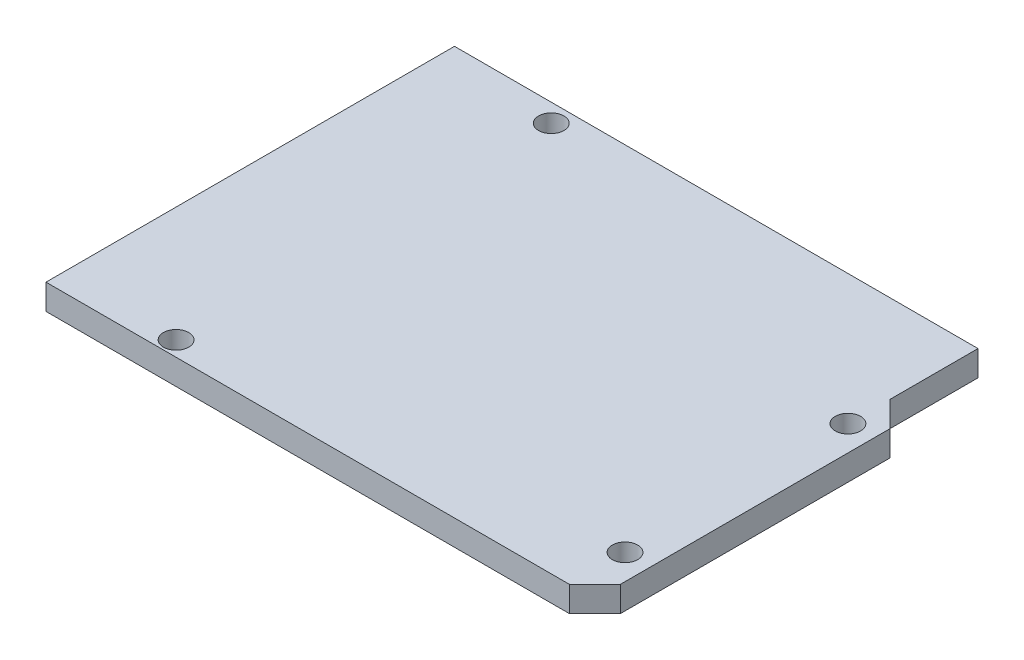
ISO-10303-21;
HEADER;
FILE_DESCRIPTION(('STEP AP214'),'2;1');
FILE_NAME('part.step','',(''),(''),'','','');
FILE_SCHEMA(('AUTOMOTIVE_DESIGN { 1 0 10303 214 1 1 1 1 }'));
ENDSEC;
DATA;
#1=APPLICATION_CONTEXT('core data for automotive mechanical design processes');
#2=APPLICATION_PROTOCOL_DEFINITION('international standard','automotive_design',2000,#1);
#3=PRODUCT_CONTEXT('',#1,'mechanical');
#4=PRODUCT('Part','Part','',(#3));
#5=PRODUCT_RELATED_PRODUCT_CATEGORY('part','',(#4));
#6=PRODUCT_DEFINITION_FORMATION('','',#4);
#7=PRODUCT_DEFINITION_CONTEXT('part definition',#1,'design');
#8=PRODUCT_DEFINITION('design','',#6,#7);
#9=PRODUCT_DEFINITION_SHAPE('','',#8);
#10=(LENGTH_UNIT() NAMED_UNIT(*) SI_UNIT(.MILLI.,.METRE.));
#11=(NAMED_UNIT(*) PLANE_ANGLE_UNIT() SI_UNIT($,.RADIAN.));
#12=(NAMED_UNIT(*) SI_UNIT($,.STERADIAN.) SOLID_ANGLE_UNIT());
#13=UNCERTAINTY_MEASURE_WITH_UNIT(LENGTH_MEASURE(1.E-05),#10,'distance_accuracy_value','');
#14=(GEOMETRIC_REPRESENTATION_CONTEXT(3) GLOBAL_UNCERTAINTY_ASSIGNED_CONTEXT((#13)) GLOBAL_UNIT_ASSIGNED_CONTEXT((#10,
#11,#12)) REPRESENTATION_CONTEXT('',''));
#15=CARTESIAN_POINT('',(0.,0.,0.));
#16=DIRECTION('',(0.,0.,1.));
#17=DIRECTION('',(1.,0.,0.));
#18=AXIS2_PLACEMENT_3D('',#15,#16,#17);
#19=CARTESIAN_POINT('',(0.,3.2,0.));
#20=DIRECTION('',(0.,1.,0.));
#21=DIRECTION('',(0.,0.,1.));
#22=AXIS2_PLACEMENT_3D('',#19,#20,#21);
#23=PLANE('',#22);
#24=CARTESIAN_POINT('',(66.,3.2,-7.));
#25=DIRECTION('',(0.,1.,0.));
#26=DIRECTION('',(0.,0.,1.));
#27=AXIS2_PLACEMENT_3D('',#24,#25,#26);
#28=CIRCLE('',#27,1.60000000000001);
#29=CARTESIAN_POINT('',(66.,3.2,-5.4));
#30=VERTEX_POINT('',#29);
#31=EDGE_CURVE('E178',#30,#30,#28,.T.);
#32=ORIENTED_EDGE('',*,*,#31,.F.);
#33=EDGE_LOOP('',(#32));
#34=FACE_BOUND('',#33,.T.);
#35=CARTESIAN_POINT('',(14.5,3.2,-1.9));
#36=DIRECTION('',(0.,1.,0.));
#37=DIRECTION('',(0.,0.,1.));
#38=AXIS2_PLACEMENT_3D('',#35,#36,#37);
#39=CIRCLE('',#38,1.6);
#40=CARTESIAN_POINT('',(14.5,3.2,-0.299999999999996));
#41=VERTEX_POINT('',#40);
#42=EDGE_CURVE('E136',#41,#41,#39,.T.);
#43=ORIENTED_EDGE('',*,*,#42,.F.);
#44=EDGE_LOOP('',(#43));
#45=FACE_BOUND('',#44,.T.);
#46=DIRECTION('',(0.,0.,1.));
#47=VECTOR('',#46,1.);
#48=CARTESIAN_POINT('',(0.,3.2,-51.5));
#49=LINE('',#48,#47);
#50=CARTESIAN_POINT('',(0.,3.2,-51.5));
#51=VERTEX_POINT('',#50);
#52=CARTESIAN_POINT('',(0.,3.2,0.));
#53=VERTEX_POINT('',#52);
#54=EDGE_CURVE('E145',#51,#53,#49,.T.);
#55=ORIENTED_EDGE('',*,*,#54,.T.);
#56=DIRECTION('',(1.,0.,0.));
#57=VECTOR('',#56,1.);
#58=CARTESIAN_POINT('',(0.,3.2,0.));
#59=LINE('',#58,#57);
#60=CARTESIAN_POINT('',(66.,3.2,0.));
#61=VERTEX_POINT('',#60);
#62=EDGE_CURVE('E98',#53,#61,#59,.T.);
#63=ORIENTED_EDGE('',*,*,#62,.T.);
#64=DIRECTION('',(0.707106781186546,0.,-0.707106781186549));
#65=VECTOR('',#64,1.);
#66=CARTESIAN_POINT('',(66.,3.2,0.));
#67=LINE('',#66,#65);
#68=CARTESIAN_POINT('',(69.2,3.2,-3.20000000000001));
#69=VERTEX_POINT('',#68);
#70=EDGE_CURVE('E157',#61,#69,#67,.T.);
#71=ORIENTED_EDGE('',*,*,#70,.T.);
#72=DIRECTION('',(0.,0.,-1.));
#73=VECTOR('',#72,1.);
#74=CARTESIAN_POINT('',(69.2,3.2,-3.20000000000001));
#75=LINE('',#74,#73);
#76=CARTESIAN_POINT('',(69.2,3.2,-37.2));
#77=VERTEX_POINT('',#76);
#78=EDGE_CURVE('E114',#69,#77,#75,.T.);
#79=ORIENTED_EDGE('',*,*,#78,.T.);
#80=DIRECTION('',(-0.707106781186551,0.,-0.707106781186544));
#81=VECTOR('',#80,1.);
#82=CARTESIAN_POINT('',(69.2,3.2,-37.2));
#83=LINE('',#82,#81);
#84=CARTESIAN_POINT('',(66.,3.2,-40.4));
#85=VERTEX_POINT('',#84);
#86=EDGE_CURVE('E108',#77,#85,#83,.T.);
#87=ORIENTED_EDGE('',*,*,#86,.T.);
#88=DIRECTION('',(0.,0.,-1.));
#89=VECTOR('',#88,1.);
#90=CARTESIAN_POINT('',(66.,3.2,-40.4));
#91=LINE('',#90,#89);
#92=CARTESIAN_POINT('',(66.,3.2,-51.5));
#93=VERTEX_POINT('',#92);
#94=EDGE_CURVE('E112',#85,#93,#91,.T.);
#95=ORIENTED_EDGE('',*,*,#94,.T.);
#96=DIRECTION('',(-1.,0.,0.));
#97=VECTOR('',#96,1.);
#98=CARTESIAN_POINT('',(66.,3.2,-51.5));
#99=LINE('',#98,#97);
#100=EDGE_CURVE('E58',#93,#51,#99,.T.);
#101=ORIENTED_EDGE('',*,*,#100,.T.);
#102=EDGE_LOOP('',(#55,#63,#71,#79,#87,#95,#101));
#103=FACE_BOUND('',#102,.T.);
#104=CARTESIAN_POINT('',(66.,3.2,-35.1));
#105=DIRECTION('',(0.,1.,0.));
#106=DIRECTION('',(0.,0.,1.));
#107=AXIS2_PLACEMENT_3D('',#104,#105,#106);
#108=CIRCLE('',#107,1.60000000000001);
#109=CARTESIAN_POINT('',(66.,3.2,-33.5));
#110=VERTEX_POINT('',#109);
#111=EDGE_CURVE('E172',#110,#110,#108,.T.);
#112=ORIENTED_EDGE('',*,*,#111,.F.);
#113=EDGE_LOOP('',(#112));
#114=FACE_BOUND('',#113,.T.);
#115=CARTESIAN_POINT('',(14.5,3.2,-49.2));
#116=DIRECTION('',(0.,1.,0.));
#117=DIRECTION('',(0.,0.,1.));
#118=AXIS2_PLACEMENT_3D('',#115,#116,#117);
#119=CIRCLE('',#118,1.6);
#120=CARTESIAN_POINT('',(14.5,3.2,-47.6));
#121=VERTEX_POINT('',#120);
#122=EDGE_CURVE('E184',#121,#121,#119,.T.);
#123=ORIENTED_EDGE('',*,*,#122,.F.);
#124=EDGE_LOOP('',(#123));
#125=FACE_BOUND('',#124,.T.);
#126=ADVANCED_FACE('F41',(#34,#45,#103,#114,#125),#23,.T.);
#127=CARTESIAN_POINT('',(0.,0.,0.));
#128=DIRECTION('',(0.,1.,0.));
#129=DIRECTION('',(0.,0.,1.));
#130=AXIS2_PLACEMENT_3D('',#127,#128,#129);
#131=PLANE('',#130);
#132=DIRECTION('',(0.,0.,1.));
#133=VECTOR('',#132,1.);
#134=CARTESIAN_POINT('',(0.,0.,-51.5));
#135=LINE('',#134,#133);
#136=CARTESIAN_POINT('',(0.,0.,-51.5));
#137=VERTEX_POINT('',#136);
#138=CARTESIAN_POINT('',(0.,0.,0.));
#139=VERTEX_POINT('',#138);
#140=EDGE_CURVE('E132',#137,#139,#135,.T.);
#141=ORIENTED_EDGE('',*,*,#140,.F.);
#142=DIRECTION('',(-1.,0.,0.));
#143=VECTOR('',#142,1.);
#144=CARTESIAN_POINT('',(66.,0.,-51.5));
#145=LINE('',#144,#143);
#146=CARTESIAN_POINT('',(66.,0.,-51.5));
#147=VERTEX_POINT('',#146);
#148=EDGE_CURVE('E90',#147,#137,#145,.T.);
#149=ORIENTED_EDGE('',*,*,#148,.F.);
#150=DIRECTION('',(0.,0.,-1.));
#151=VECTOR('',#150,1.);
#152=CARTESIAN_POINT('',(66.,0.,-40.4));
#153=LINE('',#152,#151);
#154=CARTESIAN_POINT('',(66.,0.,-40.4));
#155=VERTEX_POINT('',#154);
#156=EDGE_CURVE('E84',#155,#147,#153,.T.);
#157=ORIENTED_EDGE('',*,*,#156,.F.);
#158=DIRECTION('',(-0.707106781186551,0.,-0.707106781186544));
#159=VECTOR('',#158,1.);
#160=CARTESIAN_POINT('',(69.2,0.,-37.2));
#161=LINE('',#160,#159);
#162=CARTESIAN_POINT('',(69.2,0.,-37.2));
#163=VERTEX_POINT('',#162);
#164=EDGE_CURVE('E122',#163,#155,#161,.T.);
#165=ORIENTED_EDGE('',*,*,#164,.F.);
#166=DIRECTION('',(0.,0.,-1.));
#167=VECTOR('',#166,1.);
#168=CARTESIAN_POINT('',(69.2,0.,-3.20000000000001));
#169=LINE('',#168,#167);
#170=CARTESIAN_POINT('',(69.2,0.,-3.20000000000001));
#171=VERTEX_POINT('',#170);
#172=EDGE_CURVE('E140',#171,#163,#169,.T.);
#173=ORIENTED_EDGE('',*,*,#172,.F.);
#174=DIRECTION('',(0.707106781186546,0.,-0.707106781186549));
#175=VECTOR('',#174,1.);
#176=CARTESIAN_POINT('',(66.,0.,0.));
#177=LINE('',#176,#175);
#178=CARTESIAN_POINT('',(66.,0.,0.));
#179=VERTEX_POINT('',#178);
#180=EDGE_CURVE('E138',#179,#171,#177,.T.);
#181=ORIENTED_EDGE('',*,*,#180,.F.);
#182=DIRECTION('',(1.,0.,0.));
#183=VECTOR('',#182,1.);
#184=CARTESIAN_POINT('',(0.,0.,0.));
#185=LINE('',#184,#183);
#186=EDGE_CURVE('E135',#139,#179,#185,.T.);
#187=ORIENTED_EDGE('',*,*,#186,.F.);
#188=EDGE_LOOP('',(#141,#149,#157,#165,#173,#181,#187));
#189=FACE_BOUND('',#188,.T.);
#190=CARTESIAN_POINT('',(14.5,0.,-1.9));
#191=DIRECTION('',(0.,1.,0.));
#192=DIRECTION('',(0.,0.,1.));
#193=AXIS2_PLACEMENT_3D('',#190,#191,#192);
#194=CIRCLE('',#193,1.6);
#195=CARTESIAN_POINT('',(14.5,0.,-0.299999999999996));
#196=VERTEX_POINT('',#195);
#197=EDGE_CURVE('E169',#196,#196,#194,.T.);
#198=ORIENTED_EDGE('',*,*,#197,.T.);
#199=EDGE_LOOP('',(#198));
#200=FACE_BOUND('',#199,.T.);
#201=CARTESIAN_POINT('',(66.,0.,-35.1));
#202=DIRECTION('',(0.,1.,0.));
#203=DIRECTION('',(0.,0.,1.));
#204=AXIS2_PLACEMENT_3D('',#201,#202,#203);
#205=CIRCLE('',#204,1.60000000000001);
#206=CARTESIAN_POINT('',(66.,0.,-33.5));
#207=VERTEX_POINT('',#206);
#208=EDGE_CURVE('E175',#207,#207,#205,.T.);
#209=ORIENTED_EDGE('',*,*,#208,.T.);
#210=EDGE_LOOP('',(#209));
#211=FACE_BOUND('',#210,.T.);
#212=CARTESIAN_POINT('',(66.,0.,-7.));
#213=DIRECTION('',(0.,1.,0.));
#214=DIRECTION('',(0.,0.,1.));
#215=AXIS2_PLACEMENT_3D('',#212,#213,#214);
#216=CIRCLE('',#215,1.60000000000001);
#217=CARTESIAN_POINT('',(66.,0.,-5.4));
#218=VERTEX_POINT('',#217);
#219=EDGE_CURVE('E181',#218,#218,#216,.T.);
#220=ORIENTED_EDGE('',*,*,#219,.T.);
#221=EDGE_LOOP('',(#220));
#222=FACE_BOUND('',#221,.T.);
#223=CARTESIAN_POINT('',(14.5,0.,-49.2));
#224=DIRECTION('',(0.,1.,0.));
#225=DIRECTION('',(0.,0.,1.));
#226=AXIS2_PLACEMENT_3D('',#223,#224,#225);
#227=CIRCLE('',#226,1.6);
#228=CARTESIAN_POINT('',(14.5,0.,-47.6));
#229=VERTEX_POINT('',#228);
#230=EDGE_CURVE('E187',#229,#229,#227,.T.);
#231=ORIENTED_EDGE('',*,*,#230,.T.);
#232=EDGE_LOOP('',(#231));
#233=FACE_BOUND('',#232,.T.);
#234=ADVANCED_FACE('F161',(#189,#200,#211,#222,#233),#131,.F.);
#235=CARTESIAN_POINT('',(0.,3.2,-51.5));
#236=DIRECTION('',(1.,0.,0.));
#237=DIRECTION('',(0.,0.,-1.));
#238=AXIS2_PLACEMENT_3D('',#235,#236,#237);
#239=PLANE('',#238);
#240=ORIENTED_EDGE('',*,*,#140,.T.);
#241=DIRECTION('',(0.,-1.,0.));
#242=VECTOR('',#241,1.);
#243=CARTESIAN_POINT('',(0.,3.2,0.));
#244=LINE('',#243,#242);
#245=EDGE_CURVE('E11',#53,#139,#244,.T.);
#246=ORIENTED_EDGE('',*,*,#245,.F.);
#247=ORIENTED_EDGE('',*,*,#54,.F.);
#248=DIRECTION('',(0.,-1.,0.));
#249=VECTOR('',#248,1.);
#250=CARTESIAN_POINT('',(0.,3.2,-51.5));
#251=LINE('',#250,#249);
#252=EDGE_CURVE('E128',#51,#137,#251,.T.);
#253=ORIENTED_EDGE('',*,*,#252,.T.);
#254=EDGE_LOOP('',(#240,#246,#247,#253));
#255=FACE_BOUND('',#254,.T.);
#256=ADVANCED_FACE('F43',(#255),#239,.F.);
#257=CARTESIAN_POINT('',(0.,3.2,0.));
#258=DIRECTION('',(0.,0.,-1.));
#259=DIRECTION('',(-1.,0.,0.));
#260=AXIS2_PLACEMENT_3D('',#257,#258,#259);
#261=PLANE('',#260);
#262=ORIENTED_EDGE('',*,*,#186,.T.);
#263=DIRECTION('',(0.,-1.,0.));
#264=VECTOR('',#263,1.);
#265=CARTESIAN_POINT('',(66.,3.2,0.));
#266=LINE('',#265,#264);
#267=EDGE_CURVE('E50',#61,#179,#266,.T.);
#268=ORIENTED_EDGE('',*,*,#267,.F.);
#269=ORIENTED_EDGE('',*,*,#62,.F.);
#270=ORIENTED_EDGE('',*,*,#245,.T.);
#271=EDGE_LOOP('',(#262,#268,#269,#270));
#272=FACE_BOUND('',#271,.T.);
#273=ADVANCED_FACE('F219',(#272),#261,.F.);
#274=CARTESIAN_POINT('',(66.,3.2,0.));
#275=DIRECTION('',(-0.707106781186549,0.,-0.707106781186546));
#276=DIRECTION('',(-0.707106781186546,0.,0.707106781186549));
#277=AXIS2_PLACEMENT_3D('',#274,#275,#276);
#278=PLANE('',#277);
#279=ORIENTED_EDGE('',*,*,#180,.T.);
#280=DIRECTION('',(0.,-1.,0.));
#281=VECTOR('',#280,1.);
#282=CARTESIAN_POINT('',(69.2,3.2,-3.20000000000001));
#283=LINE('',#282,#281);
#284=EDGE_CURVE('E149',#69,#171,#283,.T.);
#285=ORIENTED_EDGE('',*,*,#284,.F.);
#286=ORIENTED_EDGE('',*,*,#70,.F.);
#287=ORIENTED_EDGE('',*,*,#267,.T.);
#288=EDGE_LOOP('',(#279,#285,#286,#287));
#289=FACE_BOUND('',#288,.T.);
#290=ADVANCED_FACE('F155',(#289),#278,.F.);
#291=CARTESIAN_POINT('',(69.2,3.2,-3.20000000000001));
#292=DIRECTION('',(-1.,0.,0.));
#293=DIRECTION('',(0.,0.,1.));
#294=AXIS2_PLACEMENT_3D('',#291,#292,#293);
#295=PLANE('',#294);
#296=ORIENTED_EDGE('',*,*,#172,.T.);
#297=DIRECTION('',(0.,-1.,0.));
#298=VECTOR('',#297,1.);
#299=CARTESIAN_POINT('',(69.2,3.2,-37.2));
#300=LINE('',#299,#298);
#301=EDGE_CURVE('E123',#77,#163,#300,.T.);
#302=ORIENTED_EDGE('',*,*,#301,.F.);
#303=ORIENTED_EDGE('',*,*,#78,.F.);
#304=ORIENTED_EDGE('',*,*,#284,.T.);
#305=EDGE_LOOP('',(#296,#302,#303,#304));
#306=FACE_BOUND('',#305,.T.);
#307=ADVANCED_FACE('F164',(#306),#295,.F.);
#308=CARTESIAN_POINT('',(69.2,3.2,-37.2));
#309=DIRECTION('',(-0.707106781186544,0.,0.707106781186551));
#310=DIRECTION('',(0.707106781186551,0.,0.707106781186544));
#311=AXIS2_PLACEMENT_3D('',#308,#309,#310);
#312=PLANE('',#311);
#313=ORIENTED_EDGE('',*,*,#164,.T.);
#314=DIRECTION('',(0.,-1.,0.));
#315=VECTOR('',#314,1.);
#316=CARTESIAN_POINT('',(66.,3.2,-40.4));
#317=LINE('',#316,#315);
#318=EDGE_CURVE('E119',#85,#155,#317,.T.);
#319=ORIENTED_EDGE('',*,*,#318,.F.);
#320=ORIENTED_EDGE('',*,*,#86,.F.);
#321=ORIENTED_EDGE('',*,*,#301,.T.);
#322=EDGE_LOOP('',(#313,#319,#320,#321));
#323=FACE_BOUND('',#322,.T.);
#324=ADVANCED_FACE('F120',(#323),#312,.F.);
#325=CARTESIAN_POINT('',(66.,3.2,-40.4));
#326=DIRECTION('',(-1.,0.,0.));
#327=DIRECTION('',(0.,0.,1.));
#328=AXIS2_PLACEMENT_3D('',#325,#326,#327);
#329=PLANE('',#328);
#330=ORIENTED_EDGE('',*,*,#156,.T.);
#331=DIRECTION('',(0.,-1.,0.));
#332=VECTOR('',#331,1.);
#333=CARTESIAN_POINT('',(66.,3.2,-51.5));
#334=LINE('',#333,#332);
#335=EDGE_CURVE('E124',#93,#147,#334,.T.);
#336=ORIENTED_EDGE('',*,*,#335,.F.);
#337=ORIENTED_EDGE('',*,*,#94,.F.);
#338=ORIENTED_EDGE('',*,*,#318,.T.);
#339=EDGE_LOOP('',(#330,#336,#337,#338));
#340=FACE_BOUND('',#339,.T.);
#341=ADVANCED_FACE('F126',(#340),#329,.F.);
#342=CARTESIAN_POINT('',(66.,3.2,-51.5));
#343=DIRECTION('',(0.,0.,1.));
#344=DIRECTION('',(1.,0.,0.));
#345=AXIS2_PLACEMENT_3D('',#342,#343,#344);
#346=PLANE('',#345);
#347=ORIENTED_EDGE('',*,*,#148,.T.);
#348=ORIENTED_EDGE('',*,*,#252,.F.);
#349=ORIENTED_EDGE('',*,*,#100,.F.);
#350=ORIENTED_EDGE('',*,*,#335,.T.);
#351=EDGE_LOOP('',(#347,#348,#349,#350));
#352=FACE_BOUND('',#351,.T.);
#353=ADVANCED_FACE('F209',(#352),#346,.F.);
#354=CARTESIAN_POINT('',(14.5,3.2,-1.9));
#355=DIRECTION('',(0.,-1.,0.));
#356=DIRECTION('',(0.,0.,-1.));
#357=AXIS2_PLACEMENT_3D('',#354,#355,#356);
#358=CYLINDRICAL_SURFACE('',#357,1.6);
#359=ORIENTED_EDGE('',*,*,#42,.T.);
#360=EDGE_LOOP('',(#359));
#361=FACE_BOUND('',#360,.T.);
#362=ORIENTED_EDGE('',*,*,#197,.F.);
#363=EDGE_LOOP('',(#362));
#364=FACE_BOUND('',#363,.T.);
#365=ADVANCED_FACE('F206',(#361,#364),#358,.F.);
#366=CARTESIAN_POINT('',(66.,3.2,-35.1));
#367=DIRECTION('',(0.,-1.,0.));
#368=DIRECTION('',(0.,0.,-1.));
#369=AXIS2_PLACEMENT_3D('',#366,#367,#368);
#370=CYLINDRICAL_SURFACE('',#369,1.60000000000001);
#371=ORIENTED_EDGE('',*,*,#111,.T.);
#372=EDGE_LOOP('',(#371));
#373=FACE_BOUND('',#372,.T.);
#374=ORIENTED_EDGE('',*,*,#208,.F.);
#375=EDGE_LOOP('',(#374));
#376=FACE_BOUND('',#375,.T.);
#377=ADVANCED_FACE('F277',(#373,#376),#370,.F.);
#378=CARTESIAN_POINT('',(66.,3.2,-7.));
#379=DIRECTION('',(0.,-1.,0.));
#380=DIRECTION('',(0.,0.,-1.));
#381=AXIS2_PLACEMENT_3D('',#378,#379,#380);
#382=CYLINDRICAL_SURFACE('',#381,1.60000000000001);
#383=ORIENTED_EDGE('',*,*,#31,.T.);
#384=EDGE_LOOP('',(#383));
#385=FACE_BOUND('',#384,.T.);
#386=ORIENTED_EDGE('',*,*,#219,.F.);
#387=EDGE_LOOP('',(#386));
#388=FACE_BOUND('',#387,.T.);
#389=ADVANCED_FACE('F285',(#385,#388),#382,.F.);
#390=CARTESIAN_POINT('',(14.5,3.2,-49.2));
#391=DIRECTION('',(0.,-1.,0.));
#392=DIRECTION('',(0.,0.,-1.));
#393=AXIS2_PLACEMENT_3D('',#390,#391,#392);
#394=CYLINDRICAL_SURFACE('',#393,1.6);
#395=ORIENTED_EDGE('',*,*,#122,.T.);
#396=EDGE_LOOP('',(#395));
#397=FACE_BOUND('',#396,.T.);
#398=ORIENTED_EDGE('',*,*,#230,.F.);
#399=EDGE_LOOP('',(#398));
#400=FACE_BOUND('',#399,.T.);
#401=ADVANCED_FACE('F193',(#397,#400),#394,.F.);
#402=CLOSED_SHELL('',(#126,#234,#256,#273,#290,#307,#324,#341,#353,#365,#377,#389,#401));
#403=MANIFOLD_SOLID_BREP('B2',#402);
#404=ADVANCED_BREP_SHAPE_REPRESENTATION('',(#18,#403),#14);
#405=SHAPE_DEFINITION_REPRESENTATION(#9,#404);
ENDSEC;
END-ISO-10303-21;
